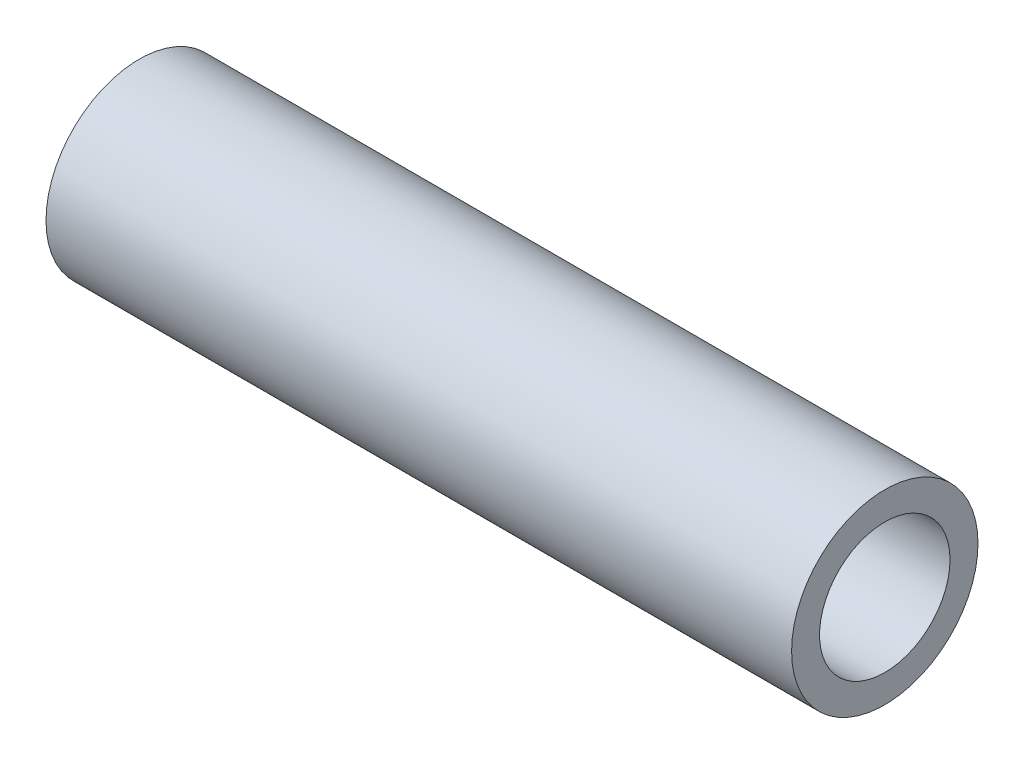
ISO-10303-21;
HEADER;
FILE_DESCRIPTION(('STEP AP214'),'2;1');
FILE_NAME('part.step','',(''),(''),'','','');
FILE_SCHEMA(('AUTOMOTIVE_DESIGN { 1 0 10303 214 1 1 1 1 }'));
ENDSEC;
DATA;
#1=APPLICATION_CONTEXT('core data for automotive mechanical design processes');
#2=APPLICATION_PROTOCOL_DEFINITION('international standard','automotive_design',2000,#1);
#3=PRODUCT_CONTEXT('',#1,'mechanical');
#4=PRODUCT('Part','Part','',(#3));
#5=PRODUCT_RELATED_PRODUCT_CATEGORY('part','',(#4));
#6=PRODUCT_DEFINITION_FORMATION('','',#4);
#7=PRODUCT_DEFINITION_CONTEXT('part definition',#1,'design');
#8=PRODUCT_DEFINITION('design','',#6,#7);
#9=PRODUCT_DEFINITION_SHAPE('','',#8);
#10=(LENGTH_UNIT() NAMED_UNIT(*) SI_UNIT(.MILLI.,.METRE.));
#11=(NAMED_UNIT(*) PLANE_ANGLE_UNIT() SI_UNIT($,.RADIAN.));
#12=(NAMED_UNIT(*) SI_UNIT($,.STERADIAN.) SOLID_ANGLE_UNIT());
#13=UNCERTAINTY_MEASURE_WITH_UNIT(LENGTH_MEASURE(1.E-05),#10,'distance_accuracy_value','');
#14=(GEOMETRIC_REPRESENTATION_CONTEXT(3) GLOBAL_UNCERTAINTY_ASSIGNED_CONTEXT((#13)) GLOBAL_UNIT_ASSIGNED_CONTEXT((#10,
#11,#12)) REPRESENTATION_CONTEXT('',''));
#15=CARTESIAN_POINT('',(0.,0.,0.));
#16=DIRECTION('',(0.,0.,1.));
#17=DIRECTION('',(1.,0.,0.));
#18=AXIS2_PLACEMENT_3D('',#15,#16,#17);
#19=CARTESIAN_POINT('',(-10.,0.,0.));
#20=DIRECTION('',(1.,0.,0.));
#21=DIRECTION('',(0.,0.,-1.));
#22=AXIS2_PLACEMENT_3D('',#19,#20,#21);
#23=CYLINDRICAL_SURFACE('',#22,2.5);
#24=CARTESIAN_POINT('',(-10.,0.,0.));
#25=DIRECTION('',(1.,0.,0.));
#26=DIRECTION('',(0.,0.,-1.));
#27=AXIS2_PLACEMENT_3D('',#24,#25,#26);
#28=CIRCLE('',#27,2.5);
#29=CARTESIAN_POINT('',(-10.,0.,-2.5));
#30=VERTEX_POINT('',#29);
#31=EDGE_CURVE('E10',#30,#30,#28,.T.);
#32=ORIENTED_EDGE('',*,*,#31,.T.);
#33=EDGE_LOOP('',(#32));
#34=FACE_BOUND('',#33,.T.);
#35=CARTESIAN_POINT('',(10.,0.,0.));
#36=DIRECTION('',(1.,0.,0.));
#37=DIRECTION('',(0.,0.,-1.));
#38=AXIS2_PLACEMENT_3D('',#35,#36,#37);
#39=CIRCLE('',#38,2.5);
#40=CARTESIAN_POINT('',(10.,0.,-2.5));
#41=VERTEX_POINT('',#40);
#42=EDGE_CURVE('E40',#41,#41,#39,.T.);
#43=ORIENTED_EDGE('',*,*,#42,.F.);
#44=EDGE_LOOP('',(#43));
#45=FACE_BOUND('',#44,.T.);
#46=ADVANCED_FACE('F30',(#34,#45),#23,.T.);
#47=CARTESIAN_POINT('',(-10.,0.,0.));
#48=DIRECTION('',(1.,0.,0.));
#49=DIRECTION('',(0.,0.,-1.));
#50=AXIS2_PLACEMENT_3D('',#47,#48,#49);
#51=PLANE('',#50);
#52=CARTESIAN_POINT('',(-10.,0.,0.));
#53=DIRECTION('',(1.,0.,0.));
#54=DIRECTION('',(0.,0.,-1.));
#55=AXIS2_PLACEMENT_3D('',#52,#53,#54);
#56=CIRCLE('',#55,1.75);
#57=CARTESIAN_POINT('',(-10.,0.,-1.75));
#58=VERTEX_POINT('',#57);
#59=EDGE_CURVE('E36',#58,#58,#56,.T.);
#60=ORIENTED_EDGE('',*,*,#59,.T.);
#61=EDGE_LOOP('',(#60));
#62=FACE_BOUND('',#61,.T.);
#63=ORIENTED_EDGE('',*,*,#31,.F.);
#64=EDGE_LOOP('',(#63));
#65=FACE_BOUND('',#64,.T.);
#66=ADVANCED_FACE('F59',(#62,#65),#51,.F.);
#67=CARTESIAN_POINT('',(-10.,0.,0.));
#68=DIRECTION('',(1.,0.,0.));
#69=DIRECTION('',(0.,0.,-1.));
#70=AXIS2_PLACEMENT_3D('',#67,#68,#69);
#71=CYLINDRICAL_SURFACE('',#70,1.75);
#72=ORIENTED_EDGE('',*,*,#59,.F.);
#73=EDGE_LOOP('',(#72));
#74=FACE_BOUND('',#73,.T.);
#75=CARTESIAN_POINT('',(10.,0.,0.));
#76=DIRECTION('',(1.,0.,0.));
#77=DIRECTION('',(0.,0.,-1.));
#78=AXIS2_PLACEMENT_3D('',#75,#76,#77);
#79=CIRCLE('',#78,1.75);
#80=CARTESIAN_POINT('',(10.,0.,-1.75));
#81=VERTEX_POINT('',#80);
#82=EDGE_CURVE('E44',#81,#81,#79,.T.);
#83=ORIENTED_EDGE('',*,*,#82,.T.);
#84=EDGE_LOOP('',(#83));
#85=FACE_BOUND('',#84,.T.);
#86=ADVANCED_FACE('F50',(#74,#85),#71,.F.);
#87=CARTESIAN_POINT('',(10.,0.,0.));
#88=DIRECTION('',(1.,0.,0.));
#89=DIRECTION('',(0.,0.,-1.));
#90=AXIS2_PLACEMENT_3D('',#87,#88,#89);
#91=PLANE('',#90);
#92=ORIENTED_EDGE('',*,*,#42,.T.);
#93=EDGE_LOOP('',(#92));
#94=FACE_BOUND('',#93,.T.);
#95=ORIENTED_EDGE('',*,*,#82,.F.);
#96=EDGE_LOOP('',(#95));
#97=FACE_BOUND('',#96,.T.);
#98=ADVANCED_FACE('F52',(#94,#97),#91,.T.);
#99=CLOSED_SHELL('',(#46,#66,#86,#98));
#100=MANIFOLD_SOLID_BREP('B2',#99);
#101=ADVANCED_BREP_SHAPE_REPRESENTATION('',(#18,#100),#14);
#102=SHAPE_DEFINITION_REPRESENTATION(#9,#101);
ENDSEC;
END-ISO-10303-21;
